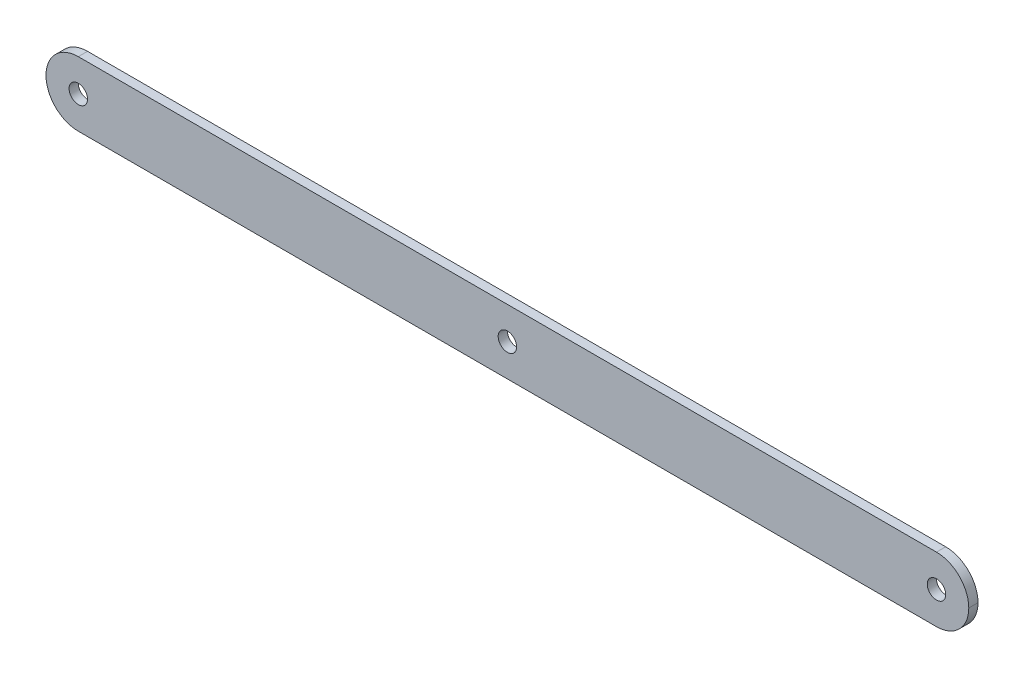
ISO-10303-21;
HEADER;
FILE_DESCRIPTION(('STEP AP214'),'2;1');
FILE_NAME('part.step','',(''),(''),'','','');
FILE_SCHEMA(('AUTOMOTIVE_DESIGN { 1 0 10303 214 1 1 1 1 }'));
ENDSEC;
DATA;
#1=APPLICATION_CONTEXT('core data for automotive mechanical design processes');
#2=APPLICATION_PROTOCOL_DEFINITION('international standard','automotive_design',2000,#1);
#3=PRODUCT_CONTEXT('',#1,'mechanical');
#4=PRODUCT('Part','Part','',(#3));
#5=PRODUCT_RELATED_PRODUCT_CATEGORY('part','',(#4));
#6=PRODUCT_DEFINITION_FORMATION('','',#4);
#7=PRODUCT_DEFINITION_CONTEXT('part definition',#1,'design');
#8=PRODUCT_DEFINITION('design','',#6,#7);
#9=PRODUCT_DEFINITION_SHAPE('','',#8);
#10=(LENGTH_UNIT() NAMED_UNIT(*) SI_UNIT(.MILLI.,.METRE.));
#11=(NAMED_UNIT(*) PLANE_ANGLE_UNIT() SI_UNIT($,.RADIAN.));
#12=(NAMED_UNIT(*) SI_UNIT($,.STERADIAN.) SOLID_ANGLE_UNIT());
#13=UNCERTAINTY_MEASURE_WITH_UNIT(LENGTH_MEASURE(1.E-05),#10,'distance_accuracy_value','');
#14=(GEOMETRIC_REPRESENTATION_CONTEXT(3) GLOBAL_UNCERTAINTY_ASSIGNED_CONTEXT((#13)) GLOBAL_UNIT_ASSIGNED_CONTEXT((#10,
#11,#12)) REPRESENTATION_CONTEXT('',''));
#15=CARTESIAN_POINT('',(0.,0.,0.));
#16=DIRECTION('',(0.,0.,1.));
#17=DIRECTION('',(1.,0.,0.));
#18=AXIS2_PLACEMENT_3D('',#15,#16,#17);
#19=CARTESIAN_POINT('',(-250.,17.5,2.5));
#20=DIRECTION('',(0.,-1.,0.));
#21=DIRECTION('',(0.,0.,-1.));
#22=AXIS2_PLACEMENT_3D('',#19,#20,#21);
#23=PLANE('',#22);
#24=DIRECTION('',(-1.,0.,0.));
#25=VECTOR('',#24,1.);
#26=CARTESIAN_POINT('',(-250.,17.5,-2.5));
#27=LINE('',#26,#25);
#28=CARTESIAN_POINT('',(232.5,17.5,-2.5));
#29=VERTEX_POINT('',#28);
#30=CARTESIAN_POINT('',(-232.5,17.5,-2.5));
#31=VERTEX_POINT('',#30);
#32=EDGE_CURVE('E128',#29,#31,#27,.T.);
#33=ORIENTED_EDGE('',*,*,#32,.T.);
#34=DIRECTION('',(0.,0.,-1.));
#35=VECTOR('',#34,1.);
#36=CARTESIAN_POINT('',(-232.5,17.5,2.5));
#37=LINE('',#36,#35);
#38=CARTESIAN_POINT('',(-232.5,17.5,2.5));
#39=VERTEX_POINT('',#38);
#40=EDGE_CURVE('E13',#31,#39,#37,.F.);
#41=ORIENTED_EDGE('',*,*,#40,.T.);
#42=DIRECTION('',(-1.,0.,0.));
#43=VECTOR('',#42,1.);
#44=CARTESIAN_POINT('',(-250.,17.5,2.5));
#45=LINE('',#44,#43);
#46=CARTESIAN_POINT('',(232.5,17.5,2.5));
#47=VERTEX_POINT('',#46);
#48=EDGE_CURVE('E127',#47,#39,#45,.T.);
#49=ORIENTED_EDGE('',*,*,#48,.F.);
#50=DIRECTION('',(0.,0.,-1.));
#51=VECTOR('',#50,1.);
#52=CARTESIAN_POINT('',(232.5,17.5,2.5));
#53=LINE('',#52,#51);
#54=EDGE_CURVE('E54',#47,#29,#53,.T.);
#55=ORIENTED_EDGE('',*,*,#54,.T.);
#56=EDGE_LOOP('',(#33,#41,#49,#55));
#57=FACE_BOUND('',#56,.T.);
#58=ADVANCED_FACE('F45',(#57),#23,.F.);
#59=CARTESIAN_POINT('',(-250.,-17.5,2.5));
#60=DIRECTION('',(0.,1.,0.));
#61=DIRECTION('',(0.,0.,1.));
#62=AXIS2_PLACEMENT_3D('',#59,#60,#61);
#63=PLANE('',#62);
#64=DIRECTION('',(1.,0.,0.));
#65=VECTOR('',#64,1.);
#66=CARTESIAN_POINT('',(-250.,-17.5,2.5));
#67=LINE('',#66,#65);
#68=CARTESIAN_POINT('',(-232.5,-17.5,2.5));
#69=VERTEX_POINT('',#68);
#70=CARTESIAN_POINT('',(232.5,-17.5,2.5));
#71=VERTEX_POINT('',#70);
#72=EDGE_CURVE('E120',#69,#71,#67,.T.);
#73=ORIENTED_EDGE('',*,*,#72,.F.);
#74=DIRECTION('',(0.,0.,-1.));
#75=VECTOR('',#74,1.);
#76=CARTESIAN_POINT('',(-232.5,-17.5,2.5));
#77=LINE('',#76,#75);
#78=CARTESIAN_POINT('',(-232.5,-17.5,-2.5));
#79=VERTEX_POINT('',#78);
#80=EDGE_CURVE('E104',#69,#79,#77,.T.);
#81=ORIENTED_EDGE('',*,*,#80,.T.);
#82=DIRECTION('',(1.,0.,0.));
#83=VECTOR('',#82,1.);
#84=CARTESIAN_POINT('',(-250.,-17.5,-2.5));
#85=LINE('',#84,#83);
#86=CARTESIAN_POINT('',(232.5,-17.5,-2.5));
#87=VERTEX_POINT('',#86);
#88=EDGE_CURVE('E117',#79,#87,#85,.T.);
#89=ORIENTED_EDGE('',*,*,#88,.T.);
#90=DIRECTION('',(0.,0.,-1.));
#91=VECTOR('',#90,1.);
#92=CARTESIAN_POINT('',(232.5,-17.5,2.5));
#93=LINE('',#92,#91);
#94=EDGE_CURVE('E122',#87,#71,#93,.F.);
#95=ORIENTED_EDGE('',*,*,#94,.T.);
#96=EDGE_LOOP('',(#73,#81,#89,#95));
#97=FACE_BOUND('',#96,.T.);
#98=ADVANCED_FACE('F115',(#97),#63,.F.);
#99=CARTESIAN_POINT('',(0.,0.,2.5));
#100=DIRECTION('',(0.,0.,1.));
#101=DIRECTION('',(1.,0.,0.));
#102=AXIS2_PLACEMENT_3D('',#99,#100,#101);
#103=PLANE('',#102);
#104=CARTESIAN_POINT('',(232.5,0.,2.5));
#105=DIRECTION('',(0.,0.,1.));
#106=DIRECTION('',(1.,0.,0.));
#107=AXIS2_PLACEMENT_3D('',#104,#105,#106);
#108=CIRCLE('',#107,4.99999999999999);
#109=CARTESIAN_POINT('',(237.5,0.,2.5));
#110=VERTEX_POINT('',#109);
#111=EDGE_CURVE('E205',#110,#110,#108,.T.);
#112=ORIENTED_EDGE('',*,*,#111,.F.);
#113=EDGE_LOOP('',(#112));
#114=FACE_BOUND('',#113,.T.);
#115=CARTESIAN_POINT('',(-232.5,0.,2.5));
#116=DIRECTION('',(0.,0.,1.));
#117=DIRECTION('',(-1.,0.,0.));
#118=AXIS2_PLACEMENT_3D('',#115,#116,#117);
#119=CIRCLE('',#118,4.99999999999999);
#120=CARTESIAN_POINT('',(-237.5,0.,2.5));
#121=VERTEX_POINT('',#120);
#122=EDGE_CURVE('E157',#121,#121,#119,.T.);
#123=ORIENTED_EDGE('',*,*,#122,.F.);
#124=EDGE_LOOP('',(#123));
#125=FACE_BOUND('',#124,.T.);
#126=CARTESIAN_POINT('',(0.,0.,2.5));
#127=DIRECTION('',(0.,0.,1.));
#128=DIRECTION('',(1.,0.,0.));
#129=AXIS2_PLACEMENT_3D('',#126,#127,#128);
#130=CIRCLE('',#129,5.);
#131=CARTESIAN_POINT('',(5.,0.,2.5));
#132=VERTEX_POINT('',#131);
#133=EDGE_CURVE('E149',#132,#132,#130,.T.);
#134=ORIENTED_EDGE('',*,*,#133,.F.);
#135=EDGE_LOOP('',(#134));
#136=FACE_BOUND('',#135,.T.);
#137=CARTESIAN_POINT('',(-232.5,0.,2.5));
#138=DIRECTION('',(0.,0.,1.));
#139=DIRECTION('',(1.,0.,0.));
#140=AXIS2_PLACEMENT_3D('',#137,#138,#139);
#141=CIRCLE('',#140,17.5);
#142=CARTESIAN_POINT('',(-250.,0.,2.5));
#143=VERTEX_POINT('',#142);
#144=EDGE_CURVE('E62',#39,#143,#141,.T.);
#145=ORIENTED_EDGE('',*,*,#144,.T.);
#146=CARTESIAN_POINT('',(-232.5,0.,2.5));
#147=DIRECTION('',(0.,0.,1.));
#148=DIRECTION('',(1.,0.,0.));
#149=AXIS2_PLACEMENT_3D('',#146,#147,#148);
#150=CIRCLE('',#149,17.5);
#151=EDGE_CURVE('E142',#143,#69,#150,.T.);
#152=ORIENTED_EDGE('',*,*,#151,.T.);
#153=ORIENTED_EDGE('',*,*,#72,.T.);
#154=CARTESIAN_POINT('',(232.5,0.,2.5));
#155=DIRECTION('',(0.,0.,1.));
#156=DIRECTION('',(1.,0.,0.));
#157=AXIS2_PLACEMENT_3D('',#154,#155,#156);
#158=CIRCLE('',#157,17.5);
#159=CARTESIAN_POINT('',(250.,0.,2.5));
#160=VERTEX_POINT('',#159);
#161=EDGE_CURVE('E139',#71,#160,#158,.T.);
#162=ORIENTED_EDGE('',*,*,#161,.T.);
#163=CARTESIAN_POINT('',(232.5,0.,2.5));
#164=DIRECTION('',(0.,0.,1.));
#165=DIRECTION('',(1.,0.,0.));
#166=AXIS2_PLACEMENT_3D('',#163,#164,#165);
#167=CIRCLE('',#166,17.5);
#168=EDGE_CURVE('E109',#160,#47,#167,.T.);
#169=ORIENTED_EDGE('',*,*,#168,.T.);
#170=ORIENTED_EDGE('',*,*,#48,.T.);
#171=EDGE_LOOP('',(#145,#152,#153,#162,#169,#170));
#172=FACE_BOUND('',#171,.T.);
#173=ADVANCED_FACE('F159',(#114,#125,#136,#172),#103,.T.);
#174=CARTESIAN_POINT('',(0.,0.,-2.5));
#175=DIRECTION('',(0.,0.,1.));
#176=DIRECTION('',(1.,0.,0.));
#177=AXIS2_PLACEMENT_3D('',#174,#175,#176);
#178=PLANE('',#177);
#179=CARTESIAN_POINT('',(232.5,0.,-2.5));
#180=DIRECTION('',(0.,0.,1.));
#181=DIRECTION('',(1.,0.,0.));
#182=AXIS2_PLACEMENT_3D('',#179,#180,#181);
#183=CIRCLE('',#182,4.99999999999999);
#184=CARTESIAN_POINT('',(237.5,0.,-2.5));
#185=VERTEX_POINT('',#184);
#186=EDGE_CURVE('E154',#185,#185,#183,.T.);
#187=ORIENTED_EDGE('',*,*,#186,.T.);
#188=EDGE_LOOP('',(#187));
#189=FACE_BOUND('',#188,.T.);
#190=CARTESIAN_POINT('',(-232.5,0.,-2.5));
#191=DIRECTION('',(0.,0.,1.));
#192=DIRECTION('',(-1.,0.,0.));
#193=AXIS2_PLACEMENT_3D('',#190,#191,#192);
#194=CIRCLE('',#193,4.99999999999999);
#195=CARTESIAN_POINT('',(-237.5,0.,-2.5));
#196=VERTEX_POINT('',#195);
#197=EDGE_CURVE('E206',#196,#196,#194,.T.);
#198=ORIENTED_EDGE('',*,*,#197,.T.);
#199=EDGE_LOOP('',(#198));
#200=FACE_BOUND('',#199,.T.);
#201=CARTESIAN_POINT('',(0.,0.,-2.5));
#202=DIRECTION('',(0.,0.,1.));
#203=DIRECTION('',(1.,0.,0.));
#204=AXIS2_PLACEMENT_3D('',#201,#202,#203);
#205=CIRCLE('',#204,5.);
#206=CARTESIAN_POINT('',(5.,0.,-2.5));
#207=VERTEX_POINT('',#206);
#208=EDGE_CURVE('E145',#207,#207,#205,.T.);
#209=ORIENTED_EDGE('',*,*,#208,.T.);
#210=EDGE_LOOP('',(#209));
#211=FACE_BOUND('',#210,.T.);
#212=ORIENTED_EDGE('',*,*,#88,.F.);
#213=CARTESIAN_POINT('',(-232.5,0.,-2.5));
#214=DIRECTION('',(0.,0.,1.));
#215=DIRECTION('',(1.,0.,0.));
#216=AXIS2_PLACEMENT_3D('',#213,#214,#215);
#217=CIRCLE('',#216,17.5);
#218=CARTESIAN_POINT('',(-250.,0.,-2.5));
#219=VERTEX_POINT('',#218);
#220=EDGE_CURVE('E100',#79,#219,#217,.F.);
#221=ORIENTED_EDGE('',*,*,#220,.T.);
#222=CARTESIAN_POINT('',(-232.5,0.,-2.5));
#223=DIRECTION('',(0.,0.,1.));
#224=DIRECTION('',(1.,0.,0.));
#225=AXIS2_PLACEMENT_3D('',#222,#223,#224);
#226=CIRCLE('',#225,17.5);
#227=EDGE_CURVE('E110',#219,#31,#226,.F.);
#228=ORIENTED_EDGE('',*,*,#227,.T.);
#229=ORIENTED_EDGE('',*,*,#32,.F.);
#230=CARTESIAN_POINT('',(232.5,0.,-2.5));
#231=DIRECTION('',(0.,0.,1.));
#232=DIRECTION('',(1.,0.,0.));
#233=AXIS2_PLACEMENT_3D('',#230,#231,#232);
#234=CIRCLE('',#233,17.5);
#235=CARTESIAN_POINT('',(250.,0.,-2.5));
#236=VERTEX_POINT('',#235);
#237=EDGE_CURVE('E121',#29,#236,#234,.F.);
#238=ORIENTED_EDGE('',*,*,#237,.T.);
#239=CARTESIAN_POINT('',(232.5,0.,-2.5));
#240=DIRECTION('',(0.,0.,1.));
#241=DIRECTION('',(1.,0.,0.));
#242=AXIS2_PLACEMENT_3D('',#239,#240,#241);
#243=CIRCLE('',#242,17.5);
#244=EDGE_CURVE('E126',#236,#87,#243,.F.);
#245=ORIENTED_EDGE('',*,*,#244,.T.);
#246=EDGE_LOOP('',(#212,#221,#228,#229,#238,#245));
#247=FACE_BOUND('',#246,.T.);
#248=ADVANCED_FACE('F124',(#189,#200,#211,#247),#178,.F.);
#249=CARTESIAN_POINT('',(-232.5,0.,2.5));
#250=DIRECTION('',(0.,0.,-1.));
#251=DIRECTION('',(-1.,0.,0.));
#252=AXIS2_PLACEMENT_3D('',#249,#250,#251);
#253=CYLINDRICAL_SURFACE('',#252,17.5);
#254=DIRECTION('',(0.,0.,-1.));
#255=VECTOR('',#254,1.);
#256=CARTESIAN_POINT('',(-250.,0.,2.5));
#257=LINE('',#256,#255);
#258=EDGE_CURVE('E105',#143,#219,#257,.T.);
#259=ORIENTED_EDGE('',*,*,#258,.F.);
#260=ORIENTED_EDGE('',*,*,#144,.F.);
#261=ORIENTED_EDGE('',*,*,#40,.F.);
#262=ORIENTED_EDGE('',*,*,#227,.F.);
#263=EDGE_LOOP('',(#259,#260,#261,#262));
#264=FACE_BOUND('',#263,.T.);
#265=ADVANCED_FACE('F166',(#264),#253,.T.);
#266=CARTESIAN_POINT('',(-232.5,0.,2.5));
#267=DIRECTION('',(0.,0.,-1.));
#268=DIRECTION('',(-1.,0.,0.));
#269=AXIS2_PLACEMENT_3D('',#266,#267,#268);
#270=CYLINDRICAL_SURFACE('',#269,17.5);
#271=ORIENTED_EDGE('',*,*,#151,.F.);
#272=ORIENTED_EDGE('',*,*,#258,.T.);
#273=ORIENTED_EDGE('',*,*,#220,.F.);
#274=ORIENTED_EDGE('',*,*,#80,.F.);
#275=EDGE_LOOP('',(#271,#272,#273,#274));
#276=FACE_BOUND('',#275,.T.);
#277=ADVANCED_FACE('F103',(#276),#270,.T.);
#278=CARTESIAN_POINT('',(232.5,0.,2.5));
#279=DIRECTION('',(0.,0.,-1.));
#280=DIRECTION('',(-1.,0.,0.));
#281=AXIS2_PLACEMENT_3D('',#278,#279,#280);
#282=CYLINDRICAL_SURFACE('',#281,17.5);
#283=ORIENTED_EDGE('',*,*,#54,.F.);
#284=ORIENTED_EDGE('',*,*,#168,.F.);
#285=DIRECTION('',(0.,0.,-1.));
#286=VECTOR('',#285,1.);
#287=CARTESIAN_POINT('',(250.,0.,2.5));
#288=LINE('',#287,#286);
#289=EDGE_CURVE('E49',#236,#160,#288,.F.);
#290=ORIENTED_EDGE('',*,*,#289,.F.);
#291=ORIENTED_EDGE('',*,*,#237,.F.);
#292=EDGE_LOOP('',(#283,#284,#290,#291));
#293=FACE_BOUND('',#292,.T.);
#294=ADVANCED_FACE('F47',(#293),#282,.T.);
#295=CARTESIAN_POINT('',(232.5,0.,2.5));
#296=DIRECTION('',(0.,0.,-1.));
#297=DIRECTION('',(-1.,0.,0.));
#298=AXIS2_PLACEMENT_3D('',#295,#296,#297);
#299=CYLINDRICAL_SURFACE('',#298,17.5);
#300=ORIENTED_EDGE('',*,*,#161,.F.);
#301=ORIENTED_EDGE('',*,*,#94,.F.);
#302=ORIENTED_EDGE('',*,*,#244,.F.);
#303=ORIENTED_EDGE('',*,*,#289,.T.);
#304=EDGE_LOOP('',(#300,#301,#302,#303));
#305=FACE_BOUND('',#304,.T.);
#306=ADVANCED_FACE('F190',(#305),#299,.T.);
#307=CARTESIAN_POINT('',(0.,0.,-2.5));
#308=DIRECTION('',(0.,0.,1.));
#309=DIRECTION('',(1.,0.,0.));
#310=AXIS2_PLACEMENT_3D('',#307,#308,#309);
#311=CYLINDRICAL_SURFACE('',#310,5.);
#312=ORIENTED_EDGE('',*,*,#208,.F.);
#313=EDGE_LOOP('',(#312));
#314=FACE_BOUND('',#313,.T.);
#315=ORIENTED_EDGE('',*,*,#133,.T.);
#316=EDGE_LOOP('',(#315));
#317=FACE_BOUND('',#316,.T.);
#318=ADVANCED_FACE('F186',(#314,#317),#311,.F.);
#319=CARTESIAN_POINT('',(-232.5,0.,-2.5));
#320=DIRECTION('',(0.,0.,1.));
#321=DIRECTION('',(1.,0.,0.));
#322=AXIS2_PLACEMENT_3D('',#319,#320,#321);
#323=CYLINDRICAL_SURFACE('',#322,4.99999999999999);
#324=ORIENTED_EDGE('',*,*,#197,.F.);
#325=EDGE_LOOP('',(#324));
#326=FACE_BOUND('',#325,.T.);
#327=ORIENTED_EDGE('',*,*,#122,.T.);
#328=EDGE_LOOP('',(#327));
#329=FACE_BOUND('',#328,.T.);
#330=ADVANCED_FACE('F189',(#326,#329),#323,.F.);
#331=CARTESIAN_POINT('',(232.5,0.,-2.5));
#332=DIRECTION('',(0.,0.,1.));
#333=DIRECTION('',(1.,0.,0.));
#334=AXIS2_PLACEMENT_3D('',#331,#332,#333);
#335=CYLINDRICAL_SURFACE('',#334,4.99999999999999);
#336=ORIENTED_EDGE('',*,*,#186,.F.);
#337=EDGE_LOOP('',(#336));
#338=FACE_BOUND('',#337,.T.);
#339=ORIENTED_EDGE('',*,*,#111,.T.);
#340=EDGE_LOOP('',(#339));
#341=FACE_BOUND('',#340,.T.);
#342=ADVANCED_FACE('F194',(#338,#341),#335,.F.);
#343=CLOSED_SHELL('',(#58,#98,#173,#248,#265,#277,#294,#306,#318,#330,#342));
#344=MANIFOLD_SOLID_BREP('B2',#343);
#345=ADVANCED_BREP_SHAPE_REPRESENTATION('',(#18,#344),#14);
#346=SHAPE_DEFINITION_REPRESENTATION(#9,#345);
ENDSEC;
END-ISO-10303-21;
